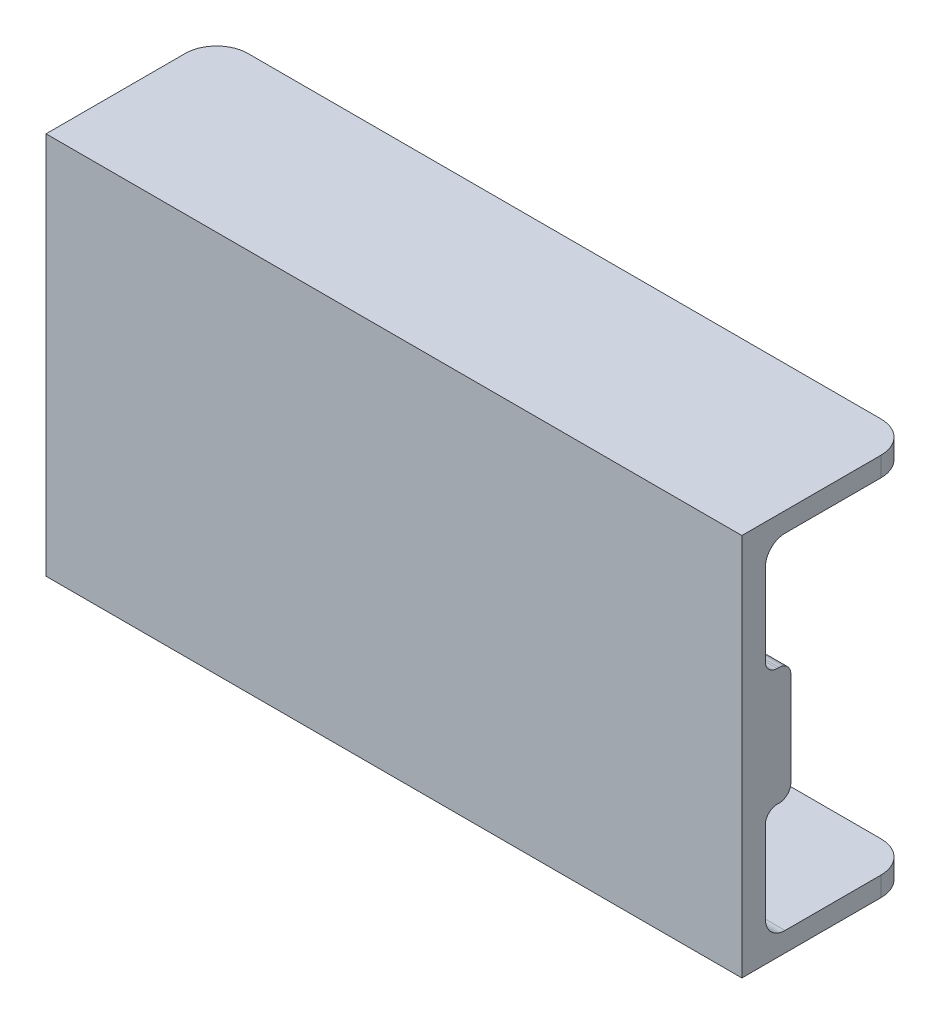
ISO-10303-21;
HEADER;
FILE_DESCRIPTION(('STEP AP214'),'2;1');
FILE_NAME('part.step','',(''),(''),'','','');
FILE_SCHEMA(('AUTOMOTIVE_DESIGN { 1 0 10303 214 1 1 1 1 }'));
ENDSEC;
DATA;
#1=APPLICATION_CONTEXT('core data for automotive mechanical design processes');
#2=APPLICATION_PROTOCOL_DEFINITION('international standard','automotive_design',2000,#1);
#3=PRODUCT_CONTEXT('',#1,'mechanical');
#4=PRODUCT('Part','Part','',(#3));
#5=PRODUCT_RELATED_PRODUCT_CATEGORY('part','',(#4));
#6=PRODUCT_DEFINITION_FORMATION('','',#4);
#7=PRODUCT_DEFINITION_CONTEXT('part definition',#1,'design');
#8=PRODUCT_DEFINITION('design','',#6,#7);
#9=PRODUCT_DEFINITION_SHAPE('','',#8);
#10=(LENGTH_UNIT() NAMED_UNIT(*) SI_UNIT(.MILLI.,.METRE.));
#11=(NAMED_UNIT(*) PLANE_ANGLE_UNIT() SI_UNIT($,.RADIAN.));
#12=(NAMED_UNIT(*) SI_UNIT($,.STERADIAN.) SOLID_ANGLE_UNIT());
#13=UNCERTAINTY_MEASURE_WITH_UNIT(LENGTH_MEASURE(1.E-05),#10,'distance_accuracy_value','');
#14=(GEOMETRIC_REPRESENTATION_CONTEXT(3) GLOBAL_UNCERTAINTY_ASSIGNED_CONTEXT((#13)) GLOBAL_UNIT_ASSIGNED_CONTEXT((#10,
#11,#12)) REPRESENTATION_CONTEXT('',''));
#15=CARTESIAN_POINT('',(0.,0.,0.));
#16=DIRECTION('',(0.,0.,1.));
#17=DIRECTION('',(1.,0.,0.));
#18=AXIS2_PLACEMENT_3D('',#15,#16,#17);
#19=CARTESIAN_POINT('',(0.,0.,0.));
#20=DIRECTION('',(0.,0.,-1.));
#21=DIRECTION('',(-1.,0.,0.));
#22=AXIS2_PLACEMENT_3D('',#19,#20,#21);
#23=PLANE('',#22);
#24=DIRECTION('',(0.,1.,0.));
#25=VECTOR('',#24,1.);
#26=CARTESIAN_POINT('',(17.75,-9.775,0.));
#27=LINE('',#26,#25);
#28=CARTESIAN_POINT('',(17.75,3.6,0.));
#29=VERTEX_POINT('',#28);
#30=CARTESIAN_POINT('',(17.75,7.775,0.));
#31=VERTEX_POINT('',#30);
#32=EDGE_CURVE('E426',#29,#31,#27,.T.);
#33=ORIENTED_EDGE('',*,*,#32,.F.);
#34=DIRECTION('',(1.,0.,0.));
#35=VECTOR('',#34,1.);
#36=CARTESIAN_POINT('',(0.,3.6,0.));
#37=LINE('',#36,#35);
#38=CARTESIAN_POINT('',(16.75,3.6,0.));
#39=VERTEX_POINT('',#38);
#40=EDGE_CURVE('E334',#29,#39,#37,.F.);
#41=ORIENTED_EDGE('',*,*,#40,.T.);
#42=DIRECTION('',(0.,1.,0.));
#43=VECTOR('',#42,1.);
#44=CARTESIAN_POINT('',(16.75,3.,0.));
#45=LINE('',#44,#43);
#46=CARTESIAN_POINT('',(16.75,-3.6,0.));
#47=VERTEX_POINT('',#46);
#48=EDGE_CURVE('E549',#47,#39,#45,.T.);
#49=ORIENTED_EDGE('',*,*,#48,.F.);
#50=DIRECTION('',(-1.,0.,0.));
#51=VECTOR('',#50,1.);
#52=CARTESIAN_POINT('',(0.,-3.6,0.));
#53=LINE('',#52,#51);
#54=CARTESIAN_POINT('',(17.75,-3.6,0.));
#55=VERTEX_POINT('',#54);
#56=EDGE_CURVE('E332',#47,#55,#53,.F.);
#57=ORIENTED_EDGE('',*,*,#56,.T.);
#58=CARTESIAN_POINT('',(17.75,-7.775,0.));
#59=VERTEX_POINT('',#58);
#60=EDGE_CURVE('E430',#59,#55,#27,.T.);
#61=ORIENTED_EDGE('',*,*,#60,.F.);
#62=DIRECTION('',(1.,0.,0.));
#63=VECTOR('',#62,1.);
#64=CARTESIAN_POINT('',(0.,-7.775,0.));
#65=LINE('',#64,#63);
#66=CARTESIAN_POINT('',(-17.75,-7.775,0.));
#67=VERTEX_POINT('',#66);
#68=EDGE_CURVE('E263',#59,#67,#65,.F.);
#69=ORIENTED_EDGE('',*,*,#68,.T.);
#70=DIRECTION('',(0.,-1.,0.));
#71=VECTOR('',#70,1.);
#72=CARTESIAN_POINT('',(-17.75,-9.775,0.));
#73=LINE('',#72,#71);
#74=CARTESIAN_POINT('',(-17.75,-3.6,0.));
#75=VERTEX_POINT('',#74);
#76=EDGE_CURVE('E433',#75,#67,#73,.T.);
#77=ORIENTED_EDGE('',*,*,#76,.F.);
#78=DIRECTION('',(-1.,0.,0.));
#79=VECTOR('',#78,1.);
#80=CARTESIAN_POINT('',(0.,-3.6,0.));
#81=LINE('',#80,#79);
#82=CARTESIAN_POINT('',(-16.75,-3.6,0.));
#83=VERTEX_POINT('',#82);
#84=EDGE_CURVE('E327',#75,#83,#81,.F.);
#85=ORIENTED_EDGE('',*,*,#84,.T.);
#86=DIRECTION('',(0.,-1.,0.));
#87=VECTOR('',#86,1.);
#88=CARTESIAN_POINT('',(-16.75,3.,0.));
#89=LINE('',#88,#87);
#90=CARTESIAN_POINT('',(-16.75,3.6,0.));
#91=VERTEX_POINT('',#90);
#92=EDGE_CURVE('E529',#91,#83,#89,.T.);
#93=ORIENTED_EDGE('',*,*,#92,.F.);
#94=DIRECTION('',(1.,0.,0.));
#95=VECTOR('',#94,1.);
#96=CARTESIAN_POINT('',(0.,3.6,0.));
#97=LINE('',#96,#95);
#98=CARTESIAN_POINT('',(-17.75,3.6,0.));
#99=VERTEX_POINT('',#98);
#100=EDGE_CURVE('E330',#91,#99,#97,.F.);
#101=ORIENTED_EDGE('',*,*,#100,.T.);
#102=CARTESIAN_POINT('',(-17.75,7.775,0.));
#103=VERTEX_POINT('',#102);
#104=EDGE_CURVE('E246',#103,#99,#73,.T.);
#105=ORIENTED_EDGE('',*,*,#104,.F.);
#106=DIRECTION('',(-1.,0.,0.));
#107=VECTOR('',#106,1.);
#108=CARTESIAN_POINT('',(0.,7.775,0.));
#109=LINE('',#108,#107);
#110=EDGE_CURVE('E255',#103,#31,#109,.F.);
#111=ORIENTED_EDGE('',*,*,#110,.T.);
#112=EDGE_LOOP('',(#33,#41,#49,#57,#61,#69,#77,#85,#93,#101,#105,#111));
#113=FACE_BOUND('',#112,.T.);
#114=ADVANCED_FACE('F33',(#113),#23,.T.);
#115=CARTESIAN_POINT('',(17.75,-9.775,1.2));
#116=DIRECTION('',(-1.,0.,0.));
#117=DIRECTION('',(0.,0.,1.));
#118=AXIS2_PLACEMENT_3D('',#115,#116,#117);
#119=PLANE('',#118);
#120=DIRECTION('',(0.,0.,-1.));
#121=VECTOR('',#120,1.);
#122=CARTESIAN_POINT('',(17.75,-9.775,1.2));
#123=LINE('',#122,#121);
#124=CARTESIAN_POINT('',(17.75,-9.775,1.2));
#125=VERTEX_POINT('',#124);
#126=CARTESIAN_POINT('',(17.75,-9.775,-5.9));
#127=VERTEX_POINT('',#126);
#128=EDGE_CURVE('E396',#125,#127,#123,.T.);
#129=ORIENTED_EDGE('',*,*,#128,.T.);
#130=DIRECTION('',(0.,-1.,0.));
#131=VECTOR('',#130,1.);
#132=CARTESIAN_POINT('',(17.75,-9.775,-5.9));
#133=LINE('',#132,#131);
#134=CARTESIAN_POINT('',(17.75,-8.775,-5.9));
#135=VERTEX_POINT('',#134);
#136=EDGE_CURVE('E366',#127,#135,#133,.F.);
#137=ORIENTED_EDGE('',*,*,#136,.T.);
#138=DIRECTION('',(0.,0.,1.));
#139=VECTOR('',#138,1.);
#140=CARTESIAN_POINT('',(17.75,-8.775,-7.5));
#141=LINE('',#140,#139);
#142=CARTESIAN_POINT('',(17.75,-8.775,-1.));
#143=VERTEX_POINT('',#142);
#144=EDGE_CURVE('E409',#135,#143,#141,.T.);
#145=ORIENTED_EDGE('',*,*,#144,.T.);
#146=CARTESIAN_POINT('',(17.75,-7.775,-1.));
#147=DIRECTION('',(-1.,0.,0.));
#148=DIRECTION('',(0.,0.,1.));
#149=AXIS2_PLACEMENT_3D('',#146,#147,#148);
#150=CIRCLE('',#149,1.);
#151=EDGE_CURVE('E269',#143,#59,#150,.T.);
#152=ORIENTED_EDGE('',*,*,#151,.T.);
#153=ORIENTED_EDGE('',*,*,#60,.T.);
#154=CARTESIAN_POINT('',(17.75,-3.6,-0.6));
#155=DIRECTION('',(-1.,0.,0.));
#156=DIRECTION('',(0.,0.,1.));
#157=AXIS2_PLACEMENT_3D('',#154,#155,#156);
#158=CIRCLE('',#157,0.6);
#159=CARTESIAN_POINT('',(17.75,-3.,-0.6));
#160=VERTEX_POINT('',#159);
#161=EDGE_CURVE('E344',#55,#160,#158,.T.);
#162=ORIENTED_EDGE('',*,*,#161,.T.);
#163=DIRECTION('',(0.,0.,1.));
#164=VECTOR('',#163,1.);
#165=CARTESIAN_POINT('',(17.75,-3.,-1.3));
#166=LINE('',#165,#164);
#167=CARTESIAN_POINT('',(17.75,-3.,-0.7));
#168=VERTEX_POINT('',#167);
#169=EDGE_CURVE('E539',#168,#160,#166,.T.);
#170=ORIENTED_EDGE('',*,*,#169,.F.);
#171=CARTESIAN_POINT('',(17.75,-2.4,-0.7));
#172=DIRECTION('',(-1.,0.,0.));
#173=DIRECTION('',(0.,0.,1.));
#174=AXIS2_PLACEMENT_3D('',#171,#172,#173);
#175=CIRCLE('',#174,0.6);
#176=CARTESIAN_POINT('',(17.75,-2.4,-1.3));
#177=VERTEX_POINT('',#176);
#178=EDGE_CURVE('E285',#168,#177,#175,.F.);
#179=ORIENTED_EDGE('',*,*,#178,.T.);
#180=DIRECTION('',(0.,-1.,0.));
#181=VECTOR('',#180,1.);
#182=CARTESIAN_POINT('',(17.75,3.,-1.3));
#183=LINE('',#182,#181);
#184=CARTESIAN_POINT('',(17.75,2.4,-1.3));
#185=VERTEX_POINT('',#184);
#186=EDGE_CURVE('E551',#185,#177,#183,.T.);
#187=ORIENTED_EDGE('',*,*,#186,.F.);
#188=CARTESIAN_POINT('',(17.75,2.4,-0.7));
#189=DIRECTION('',(-1.,0.,0.));
#190=DIRECTION('',(0.,0.,1.));
#191=AXIS2_PLACEMENT_3D('',#188,#189,#190);
#192=CIRCLE('',#191,0.6);
#193=CARTESIAN_POINT('',(17.75,3.,-0.7));
#194=VERTEX_POINT('',#193);
#195=EDGE_CURVE('E287',#185,#194,#192,.F.);
#196=ORIENTED_EDGE('',*,*,#195,.T.);
#197=DIRECTION('',(0.,0.,1.));
#198=VECTOR('',#197,1.);
#199=CARTESIAN_POINT('',(17.75,3.,-1.3));
#200=LINE('',#199,#198);
#201=CARTESIAN_POINT('',(17.75,3.,-0.6));
#202=VERTEX_POINT('',#201);
#203=EDGE_CURVE('E532',#194,#202,#200,.T.);
#204=ORIENTED_EDGE('',*,*,#203,.T.);
#205=CARTESIAN_POINT('',(17.75,3.6,-0.6));
#206=DIRECTION('',(-1.,0.,0.));
#207=DIRECTION('',(0.,0.,1.));
#208=AXIS2_PLACEMENT_3D('',#205,#206,#207);
#209=CIRCLE('',#208,0.6);
#210=EDGE_CURVE('E337',#202,#29,#209,.T.);
#211=ORIENTED_EDGE('',*,*,#210,.T.);
#212=ORIENTED_EDGE('',*,*,#32,.T.);
#213=CARTESIAN_POINT('',(17.75,7.775,-1.));
#214=DIRECTION('',(-1.,0.,0.));
#215=DIRECTION('',(0.,0.,1.));
#216=AXIS2_PLACEMENT_3D('',#213,#214,#215);
#217=CIRCLE('',#216,1.);
#218=CARTESIAN_POINT('',(17.75,8.775,-1.));
#219=VERTEX_POINT('',#218);
#220=EDGE_CURVE('E276',#31,#219,#217,.T.);
#221=ORIENTED_EDGE('',*,*,#220,.T.);
#222=DIRECTION('',(0.,0.,1.));
#223=VECTOR('',#222,1.);
#224=CARTESIAN_POINT('',(17.75,8.775,-7.5));
#225=LINE('',#224,#223);
#226=CARTESIAN_POINT('',(17.75,8.775,-5.9));
#227=VERTEX_POINT('',#226);
#228=EDGE_CURVE('E425',#227,#219,#225,.T.);
#229=ORIENTED_EDGE('',*,*,#228,.F.);
#230=DIRECTION('',(0.,-1.,0.));
#231=VECTOR('',#230,1.);
#232=CARTESIAN_POINT('',(17.75,9.775,-5.9));
#233=LINE('',#232,#231);
#234=CARTESIAN_POINT('',(17.75,9.775,-5.9));
#235=VERTEX_POINT('',#234);
#236=EDGE_CURVE('E251',#227,#235,#233,.F.);
#237=ORIENTED_EDGE('',*,*,#236,.T.);
#238=DIRECTION('',(0.,0.,-1.));
#239=VECTOR('',#238,1.);
#240=CARTESIAN_POINT('',(17.75,9.775,1.2));
#241=LINE('',#240,#239);
#242=CARTESIAN_POINT('',(17.75,9.775,1.2));
#243=VERTEX_POINT('',#242);
#244=EDGE_CURVE('E231',#243,#235,#241,.T.);
#245=ORIENTED_EDGE('',*,*,#244,.F.);
#246=DIRECTION('',(0.,1.,0.));
#247=VECTOR('',#246,1.);
#248=CARTESIAN_POINT('',(17.75,-9.775,1.2));
#249=LINE('',#248,#247);
#250=EDGE_CURVE('E237',#125,#243,#249,.T.);
#251=ORIENTED_EDGE('',*,*,#250,.F.);
#252=EDGE_LOOP('',(#129,#137,#145,#152,#153,#162,#170,#179,#187,#196,#204,#211,#212,#221,#229,
#237,#245,#251));
#253=FACE_BOUND('',#252,.T.);
#254=ADVANCED_FACE('F248',(#253),#119,.F.);
#255=CARTESIAN_POINT('',(-17.75,9.775,1.2));
#256=DIRECTION('',(0.,-1.,0.));
#257=DIRECTION('',(0.,0.,-1.));
#258=AXIS2_PLACEMENT_3D('',#255,#256,#257);
#259=PLANE('',#258);
#260=ORIENTED_EDGE('',*,*,#244,.T.);
#261=CARTESIAN_POINT('',(16.15,9.775,-5.9));
#262=DIRECTION('',(0.,-1.,0.));
#263=DIRECTION('',(0.,0.,-1.));
#264=AXIS2_PLACEMENT_3D('',#261,#262,#263);
#265=CIRCLE('',#264,1.6);
#266=CARTESIAN_POINT('',(16.15,9.775,-7.5));
#267=VERTEX_POINT('',#266);
#268=EDGE_CURVE('E383',#235,#267,#265,.F.);
#269=ORIENTED_EDGE('',*,*,#268,.T.);
#270=DIRECTION('',(1.,0.,0.));
#271=VECTOR('',#270,1.);
#272=CARTESIAN_POINT('',(17.75,9.775,-7.5));
#273=LINE('',#272,#271);
#274=CARTESIAN_POINT('',(-16.15,9.775,-7.5));
#275=VERTEX_POINT('',#274);
#276=EDGE_CURVE('E420',#275,#267,#273,.T.);
#277=ORIENTED_EDGE('',*,*,#276,.F.);
#278=CARTESIAN_POINT('',(-16.15,9.775,-5.9));
#279=DIRECTION('',(0.,-1.,0.));
#280=DIRECTION('',(0.,0.,-1.));
#281=AXIS2_PLACEMENT_3D('',#278,#279,#280);
#282=CIRCLE('',#281,1.6);
#283=CARTESIAN_POINT('',(-17.75,9.775,-5.9));
#284=VERTEX_POINT('',#283);
#285=EDGE_CURVE('E48',#275,#284,#282,.F.);
#286=ORIENTED_EDGE('',*,*,#285,.T.);
#287=DIRECTION('',(0.,0.,-1.));
#288=VECTOR('',#287,1.);
#289=CARTESIAN_POINT('',(-17.75,9.775,1.2));
#290=LINE('',#289,#288);
#291=CARTESIAN_POINT('',(-17.75,9.775,1.2));
#292=VERTEX_POINT('',#291);
#293=EDGE_CURVE('E233',#292,#284,#290,.T.);
#294=ORIENTED_EDGE('',*,*,#293,.F.);
#295=DIRECTION('',(-1.,0.,0.));
#296=VECTOR('',#295,1.);
#297=CARTESIAN_POINT('',(-17.75,9.775,1.2));
#298=LINE('',#297,#296);
#299=EDGE_CURVE('E227',#243,#292,#298,.T.);
#300=ORIENTED_EDGE('',*,*,#299,.F.);
#301=EDGE_LOOP('',(#260,#269,#277,#286,#294,#300));
#302=FACE_BOUND('',#301,.T.);
#303=ADVANCED_FACE('F229',(#302),#259,.F.);
#304=CARTESIAN_POINT('',(-17.75,-9.775,1.2));
#305=DIRECTION('',(1.,0.,0.));
#306=DIRECTION('',(0.,0.,-1.));
#307=AXIS2_PLACEMENT_3D('',#304,#305,#306);
#308=PLANE('',#307);
#309=ORIENTED_EDGE('',*,*,#293,.T.);
#310=DIRECTION('',(0.,1.,0.));
#311=VECTOR('',#310,1.);
#312=CARTESIAN_POINT('',(-17.75,8.775,-5.9));
#313=LINE('',#312,#311);
#314=CARTESIAN_POINT('',(-17.75,8.775,-5.9));
#315=VERTEX_POINT('',#314);
#316=EDGE_CURVE('E11',#284,#315,#313,.F.);
#317=ORIENTED_EDGE('',*,*,#316,.T.);
#318=DIRECTION('',(0.,0.,1.));
#319=VECTOR('',#318,1.);
#320=CARTESIAN_POINT('',(-17.75,8.775,-7.5));
#321=LINE('',#320,#319);
#322=CARTESIAN_POINT('',(-17.75,8.775,-1.));
#323=VERTEX_POINT('',#322);
#324=EDGE_CURVE('E423',#315,#323,#321,.T.);
#325=ORIENTED_EDGE('',*,*,#324,.T.);
#326=CARTESIAN_POINT('',(-17.75,7.775,-1.));
#327=DIRECTION('',(1.,0.,0.));
#328=DIRECTION('',(0.,0.,-1.));
#329=AXIS2_PLACEMENT_3D('',#326,#327,#328);
#330=CIRCLE('',#329,1.);
#331=EDGE_CURVE('E274',#323,#103,#330,.T.);
#332=ORIENTED_EDGE('',*,*,#331,.T.);
#333=ORIENTED_EDGE('',*,*,#104,.T.);
#334=CARTESIAN_POINT('',(-17.75,3.6,-0.6));
#335=DIRECTION('',(1.,0.,0.));
#336=DIRECTION('',(0.,0.,-1.));
#337=AXIS2_PLACEMENT_3D('',#334,#335,#336);
#338=CIRCLE('',#337,0.6);
#339=CARTESIAN_POINT('',(-17.75,3.,-0.6));
#340=VERTEX_POINT('',#339);
#341=EDGE_CURVE('E349',#99,#340,#338,.T.);
#342=ORIENTED_EDGE('',*,*,#341,.T.);
#343=DIRECTION('',(0.,0.,1.));
#344=VECTOR('',#343,1.);
#345=CARTESIAN_POINT('',(-17.75,3.,-1.3));
#346=LINE('',#345,#344);
#347=CARTESIAN_POINT('',(-17.75,3.,-0.7));
#348=VERTEX_POINT('',#347);
#349=EDGE_CURVE('E412',#348,#340,#346,.T.);
#350=ORIENTED_EDGE('',*,*,#349,.F.);
#351=CARTESIAN_POINT('',(-17.75,2.4,-0.7));
#352=DIRECTION('',(1.,0.,0.));
#353=DIRECTION('',(0.,0.,-1.));
#354=AXIS2_PLACEMENT_3D('',#351,#352,#353);
#355=CIRCLE('',#354,0.6);
#356=CARTESIAN_POINT('',(-17.75,2.4,-1.3));
#357=VERTEX_POINT('',#356);
#358=EDGE_CURVE('E320',#348,#357,#355,.F.);
#359=ORIENTED_EDGE('',*,*,#358,.T.);
#360=DIRECTION('',(0.,1.,0.));
#361=VECTOR('',#360,1.);
#362=CARTESIAN_POINT('',(-17.75,3.,-1.3));
#363=LINE('',#362,#361);
#364=CARTESIAN_POINT('',(-17.75,-2.4,-1.3));
#365=VERTEX_POINT('',#364);
#366=EDGE_CURVE('E531',#365,#357,#363,.T.);
#367=ORIENTED_EDGE('',*,*,#366,.F.);
#368=CARTESIAN_POINT('',(-17.75,-2.4,-0.7));
#369=DIRECTION('',(1.,0.,0.));
#370=DIRECTION('',(0.,0.,-1.));
#371=AXIS2_PLACEMENT_3D('',#368,#369,#370);
#372=CIRCLE('',#371,0.6);
#373=CARTESIAN_POINT('',(-17.75,-3.,-0.7));
#374=VERTEX_POINT('',#373);
#375=EDGE_CURVE('E318',#365,#374,#372,.F.);
#376=ORIENTED_EDGE('',*,*,#375,.T.);
#377=DIRECTION('',(0.,0.,1.));
#378=VECTOR('',#377,1.);
#379=CARTESIAN_POINT('',(-17.75,-3.,-1.3));
#380=LINE('',#379,#378);
#381=CARTESIAN_POINT('',(-17.75,-3.,-0.6));
#382=VERTEX_POINT('',#381);
#383=EDGE_CURVE('E525',#374,#382,#380,.T.);
#384=ORIENTED_EDGE('',*,*,#383,.T.);
#385=CARTESIAN_POINT('',(-17.75,-3.6,-0.6));
#386=DIRECTION('',(1.,0.,0.));
#387=DIRECTION('',(0.,0.,-1.));
#388=AXIS2_PLACEMENT_3D('',#385,#386,#387);
#389=CIRCLE('',#388,0.6);
#390=EDGE_CURVE('E351',#382,#75,#389,.T.);
#391=ORIENTED_EDGE('',*,*,#390,.T.);
#392=ORIENTED_EDGE('',*,*,#76,.T.);
#393=CARTESIAN_POINT('',(-17.75,-7.775,-1.));
#394=DIRECTION('',(1.,0.,0.));
#395=DIRECTION('',(0.,0.,-1.));
#396=AXIS2_PLACEMENT_3D('',#393,#394,#395);
#397=CIRCLE('',#396,1.);
#398=CARTESIAN_POINT('',(-17.75,-8.775,-1.));
#399=VERTEX_POINT('',#398);
#400=EDGE_CURVE('E271',#67,#399,#397,.T.);
#401=ORIENTED_EDGE('',*,*,#400,.T.);
#402=DIRECTION('',(0.,0.,1.));
#403=VECTOR('',#402,1.);
#404=CARTESIAN_POINT('',(-17.75,-8.775,-7.5));
#405=LINE('',#404,#403);
#406=CARTESIAN_POINT('',(-17.75,-8.775,-5.9));
#407=VERTEX_POINT('',#406);
#408=EDGE_CURVE('E389',#407,#399,#405,.T.);
#409=ORIENTED_EDGE('',*,*,#408,.F.);
#410=DIRECTION('',(0.,1.,0.));
#411=VECTOR('',#410,1.);
#412=CARTESIAN_POINT('',(-17.75,-9.775,-5.9));
#413=LINE('',#412,#411);
#414=CARTESIAN_POINT('',(-17.75,-9.775,-5.9));
#415=VERTEX_POINT('',#414);
#416=EDGE_CURVE('E41',#407,#415,#413,.F.);
#417=ORIENTED_EDGE('',*,*,#416,.T.);
#418=DIRECTION('',(0.,0.,-1.));
#419=VECTOR('',#418,1.);
#420=CARTESIAN_POINT('',(-17.75,-9.775,1.2));
#421=LINE('',#420,#419);
#422=CARTESIAN_POINT('',(-17.75,-9.775,1.2));
#423=VERTEX_POINT('',#422);
#424=EDGE_CURVE('E257',#423,#415,#421,.T.);
#425=ORIENTED_EDGE('',*,*,#424,.F.);
#426=DIRECTION('',(0.,-1.,0.));
#427=VECTOR('',#426,1.);
#428=CARTESIAN_POINT('',(-17.75,-9.775,1.2));
#429=LINE('',#428,#427);
#430=EDGE_CURVE('E236',#292,#423,#429,.T.);
#431=ORIENTED_EDGE('',*,*,#430,.F.);
#432=EDGE_LOOP('',(#309,#317,#325,#332,#333,#342,#350,#359,#367,#376,#384,#391,#392,#401,#409,
#417,#425,#431));
#433=FACE_BOUND('',#432,.T.);
#434=ADVANCED_FACE('F388',(#433),#308,.F.);
#435=CARTESIAN_POINT('',(-17.75,-9.775,1.2));
#436=DIRECTION('',(0.,1.,0.));
#437=DIRECTION('',(0.,0.,1.));
#438=AXIS2_PLACEMENT_3D('',#435,#436,#437);
#439=PLANE('',#438);
#440=DIRECTION('',(-1.,0.,0.));
#441=VECTOR('',#440,1.);
#442=CARTESIAN_POINT('',(17.75,-9.775,-7.5));
#443=LINE('',#442,#441);
#444=CARTESIAN_POINT('',(16.15,-9.775,-7.5));
#445=VERTEX_POINT('',#444);
#446=CARTESIAN_POINT('',(-16.15,-9.775,-7.5));
#447=VERTEX_POINT('',#446);
#448=EDGE_CURVE('E404',#445,#447,#443,.T.);
#449=ORIENTED_EDGE('',*,*,#448,.F.);
#450=CARTESIAN_POINT('',(16.15,-9.775,-5.9));
#451=DIRECTION('',(0.,1.,0.));
#452=DIRECTION('',(0.,0.,1.));
#453=AXIS2_PLACEMENT_3D('',#450,#451,#452);
#454=CIRCLE('',#453,1.6);
#455=EDGE_CURVE('E363',#445,#127,#454,.F.);
#456=ORIENTED_EDGE('',*,*,#455,.T.);
#457=ORIENTED_EDGE('',*,*,#128,.F.);
#458=DIRECTION('',(1.,0.,0.));
#459=VECTOR('',#458,1.);
#460=CARTESIAN_POINT('',(-17.75,-9.775,1.2));
#461=LINE('',#460,#459);
#462=EDGE_CURVE('E242',#423,#125,#461,.T.);
#463=ORIENTED_EDGE('',*,*,#462,.F.);
#464=ORIENTED_EDGE('',*,*,#424,.T.);
#465=CARTESIAN_POINT('',(-16.15,-9.775,-5.9));
#466=DIRECTION('',(0.,1.,0.));
#467=DIRECTION('',(0.,0.,1.));
#468=AXIS2_PLACEMENT_3D('',#465,#466,#467);
#469=CIRCLE('',#468,1.6);
#470=EDGE_CURVE('E361',#415,#447,#469,.F.);
#471=ORIENTED_EDGE('',*,*,#470,.T.);
#472=EDGE_LOOP('',(#449,#456,#457,#463,#464,#471));
#473=FACE_BOUND('',#472,.T.);
#474=ADVANCED_FACE('F394',(#473),#439,.F.);
#475=CARTESIAN_POINT('',(0.,0.,1.2));
#476=DIRECTION('',(0.,0.,-1.));
#477=DIRECTION('',(-1.,0.,0.));
#478=AXIS2_PLACEMENT_3D('',#475,#476,#477);
#479=PLANE('',#478);
#480=ORIENTED_EDGE('',*,*,#250,.T.);
#481=ORIENTED_EDGE('',*,*,#299,.T.);
#482=ORIENTED_EDGE('',*,*,#430,.T.);
#483=ORIENTED_EDGE('',*,*,#462,.T.);
#484=EDGE_LOOP('',(#480,#481,#482,#483));
#485=FACE_BOUND('',#484,.T.);
#486=ADVANCED_FACE('F240',(#485),#479,.F.);
#487=CARTESIAN_POINT('',(17.75,8.775,-7.5));
#488=DIRECTION('',(0.,1.,0.));
#489=DIRECTION('',(0.,0.,1.));
#490=AXIS2_PLACEMENT_3D('',#487,#488,#489);
#491=PLANE('',#490);
#492=DIRECTION('',(-1.,0.,0.));
#493=VECTOR('',#492,1.);
#494=CARTESIAN_POINT('',(17.75,8.775,-7.5));
#495=LINE('',#494,#493);
#496=CARTESIAN_POINT('',(16.15,8.775,-7.5));
#497=VERTEX_POINT('',#496);
#498=CARTESIAN_POINT('',(-16.15,8.775,-7.5));
#499=VERTEX_POINT('',#498);
#500=EDGE_CURVE('E417',#497,#499,#495,.T.);
#501=ORIENTED_EDGE('',*,*,#500,.F.);
#502=CARTESIAN_POINT('',(16.15,8.775,-5.9));
#503=DIRECTION('',(0.,1.,0.));
#504=DIRECTION('',(0.,0.,1.));
#505=AXIS2_PLACEMENT_3D('',#502,#503,#504);
#506=CIRCLE('',#505,1.6);
#507=EDGE_CURVE('E380',#497,#227,#506,.F.);
#508=ORIENTED_EDGE('',*,*,#507,.T.);
#509=ORIENTED_EDGE('',*,*,#228,.T.);
#510=DIRECTION('',(-1.,0.,0.));
#511=VECTOR('',#510,1.);
#512=CARTESIAN_POINT('',(17.75,8.775,-1.));
#513=LINE('',#512,#511);
#514=EDGE_CURVE('E266',#219,#323,#513,.T.);
#515=ORIENTED_EDGE('',*,*,#514,.T.);
#516=ORIENTED_EDGE('',*,*,#324,.F.);
#517=CARTESIAN_POINT('',(-16.15,8.775,-5.9));
#518=DIRECTION('',(0.,1.,0.));
#519=DIRECTION('',(0.,0.,1.));
#520=AXIS2_PLACEMENT_3D('',#517,#518,#519);
#521=CIRCLE('',#520,1.6);
#522=EDGE_CURVE('E378',#315,#499,#521,.F.);
#523=ORIENTED_EDGE('',*,*,#522,.T.);
#524=EDGE_LOOP('',(#501,#508,#509,#515,#516,#523));
#525=FACE_BOUND('',#524,.T.);
#526=ADVANCED_FACE('F586',(#525),#491,.F.);
#527=CARTESIAN_POINT('',(0.,0.,-7.5));
#528=DIRECTION('',(0.,0.,-1.));
#529=DIRECTION('',(-1.,0.,0.));
#530=AXIS2_PLACEMENT_3D('',#527,#528,#529);
#531=PLANE('',#530);
#532=ORIENTED_EDGE('',*,*,#276,.T.);
#533=DIRECTION('',(0.,-1.,0.));
#534=VECTOR('',#533,1.);
#535=CARTESIAN_POINT('',(16.15,8.775,-7.5));
#536=LINE('',#535,#534);
#537=EDGE_CURVE('E375',#267,#497,#536,.T.);
#538=ORIENTED_EDGE('',*,*,#537,.T.);
#539=ORIENTED_EDGE('',*,*,#500,.T.);
#540=DIRECTION('',(0.,1.,0.));
#541=VECTOR('',#540,1.);
#542=CARTESIAN_POINT('',(-16.15,9.775,-7.5));
#543=LINE('',#542,#541);
#544=EDGE_CURVE('E372',#499,#275,#543,.T.);
#545=ORIENTED_EDGE('',*,*,#544,.T.);
#546=EDGE_LOOP('',(#532,#538,#539,#545));
#547=FACE_BOUND('',#546,.T.);
#548=ADVANCED_FACE('F590',(#547),#531,.T.);
#549=CARTESIAN_POINT('',(17.75,-8.775,-7.5));
#550=DIRECTION('',(0.,-1.,0.));
#551=DIRECTION('',(0.,0.,-1.));
#552=AXIS2_PLACEMENT_3D('',#549,#550,#551);
#553=PLANE('',#552);
#554=ORIENTED_EDGE('',*,*,#144,.F.);
#555=CARTESIAN_POINT('',(16.15,-8.775,-5.9));
#556=DIRECTION('',(0.,-1.,0.));
#557=DIRECTION('',(0.,0.,-1.));
#558=AXIS2_PLACEMENT_3D('',#555,#556,#557);
#559=CIRCLE('',#558,1.6);
#560=CARTESIAN_POINT('',(16.15,-8.775,-7.5));
#561=VERTEX_POINT('',#560);
#562=EDGE_CURVE('E370',#135,#561,#559,.F.);
#563=ORIENTED_EDGE('',*,*,#562,.T.);
#564=DIRECTION('',(1.,0.,0.));
#565=VECTOR('',#564,1.);
#566=CARTESIAN_POINT('',(17.75,-8.775,-7.5));
#567=LINE('',#566,#565);
#568=CARTESIAN_POINT('',(-16.15,-8.775,-7.5));
#569=VERTEX_POINT('',#568);
#570=EDGE_CURVE('E402',#569,#561,#567,.T.);
#571=ORIENTED_EDGE('',*,*,#570,.F.);
#572=CARTESIAN_POINT('',(-16.15,-8.775,-5.9));
#573=DIRECTION('',(0.,-1.,0.));
#574=DIRECTION('',(0.,0.,-1.));
#575=AXIS2_PLACEMENT_3D('',#572,#573,#574);
#576=CIRCLE('',#575,1.6);
#577=EDGE_CURVE('E368',#569,#407,#576,.F.);
#578=ORIENTED_EDGE('',*,*,#577,.T.);
#579=ORIENTED_EDGE('',*,*,#408,.T.);
#580=DIRECTION('',(1.,0.,0.));
#581=VECTOR('',#580,1.);
#582=CARTESIAN_POINT('',(17.75,-8.775,-1.));
#583=LINE('',#582,#581);
#584=EDGE_CURVE('E252',#399,#143,#583,.T.);
#585=ORIENTED_EDGE('',*,*,#584,.T.);
#586=EDGE_LOOP('',(#554,#563,#571,#578,#579,#585));
#587=FACE_BOUND('',#586,.T.);
#588=ADVANCED_FACE('F407',(#587),#553,.F.);
#589=CARTESIAN_POINT('',(0.,0.,-7.5));
#590=DIRECTION('',(0.,0.,1.));
#591=DIRECTION('',(1.,0.,0.));
#592=AXIS2_PLACEMENT_3D('',#589,#590,#591);
#593=PLANE('',#592);
#594=ORIENTED_EDGE('',*,*,#570,.T.);
#595=DIRECTION('',(0.,-1.,0.));
#596=VECTOR('',#595,1.);
#597=CARTESIAN_POINT('',(16.15,0.,-7.5));
#598=LINE('',#597,#596);
#599=EDGE_CURVE('E358',#561,#445,#598,.T.);
#600=ORIENTED_EDGE('',*,*,#599,.T.);
#601=ORIENTED_EDGE('',*,*,#448,.T.);
#602=DIRECTION('',(0.,1.,0.));
#603=VECTOR('',#602,1.);
#604=CARTESIAN_POINT('',(-16.15,0.,-7.5));
#605=LINE('',#604,#603);
#606=EDGE_CURVE('E355',#447,#569,#605,.T.);
#607=ORIENTED_EDGE('',*,*,#606,.T.);
#608=EDGE_LOOP('',(#594,#600,#601,#607));
#609=FACE_BOUND('',#608,.T.);
#610=ADVANCED_FACE('F401',(#609),#593,.F.);
#611=CARTESIAN_POINT('',(17.75,-7.775,-1.));
#612=DIRECTION('',(1.,0.,0.));
#613=DIRECTION('',(0.,0.,-1.));
#614=AXIS2_PLACEMENT_3D('',#611,#612,#613);
#615=CYLINDRICAL_SURFACE('',#614,1.);
#616=ORIENTED_EDGE('',*,*,#400,.F.);
#617=ORIENTED_EDGE('',*,*,#68,.F.);
#618=ORIENTED_EDGE('',*,*,#151,.F.);
#619=ORIENTED_EDGE('',*,*,#584,.F.);
#620=EDGE_LOOP('',(#616,#617,#618,#619));
#621=FACE_BOUND('',#620,.T.);
#622=ADVANCED_FACE('F470',(#621),#615,.F.);
#623=CARTESIAN_POINT('',(17.75,7.775,-1.));
#624=DIRECTION('',(-1.,0.,0.));
#625=DIRECTION('',(0.,0.,1.));
#626=AXIS2_PLACEMENT_3D('',#623,#624,#625);
#627=CYLINDRICAL_SURFACE('',#626,1.);
#628=ORIENTED_EDGE('',*,*,#220,.F.);
#629=ORIENTED_EDGE('',*,*,#110,.F.);
#630=ORIENTED_EDGE('',*,*,#331,.F.);
#631=ORIENTED_EDGE('',*,*,#514,.F.);
#632=EDGE_LOOP('',(#628,#629,#630,#631));
#633=FACE_BOUND('',#632,.T.);
#634=ADVANCED_FACE('F473',(#633),#627,.F.);
#635=CARTESIAN_POINT('',(-17.75,3.,-1.3));
#636=DIRECTION('',(0.,-1.,0.));
#637=DIRECTION('',(0.,0.,-1.));
#638=AXIS2_PLACEMENT_3D('',#635,#636,#637);
#639=PLANE('',#638);
#640=DIRECTION('',(0.,0.,1.));
#641=VECTOR('',#640,1.);
#642=CARTESIAN_POINT('',(-16.75,3.,-1.3));
#643=LINE('',#642,#641);
#644=CARTESIAN_POINT('',(-16.75,3.,-0.7));
#645=VERTEX_POINT('',#644);
#646=CARTESIAN_POINT('',(-16.75,3.,-0.6));
#647=VERTEX_POINT('',#646);
#648=EDGE_CURVE('E519',#645,#647,#643,.T.);
#649=ORIENTED_EDGE('',*,*,#648,.F.);
#650=DIRECTION('',(1.,0.,0.));
#651=VECTOR('',#650,1.);
#652=CARTESIAN_POINT('',(-17.75,3.,-0.7));
#653=LINE('',#652,#651);
#654=EDGE_CURVE('E316',#645,#348,#653,.F.);
#655=ORIENTED_EDGE('',*,*,#654,.T.);
#656=ORIENTED_EDGE('',*,*,#349,.T.);
#657=DIRECTION('',(1.,0.,0.));
#658=VECTOR('',#657,1.);
#659=CARTESIAN_POINT('',(-17.75,3.,-0.6));
#660=LINE('',#659,#658);
#661=EDGE_CURVE('E313',#340,#647,#660,.T.);
#662=ORIENTED_EDGE('',*,*,#661,.T.);
#663=EDGE_LOOP('',(#649,#655,#656,#662));
#664=FACE_BOUND('',#663,.T.);
#665=ADVANCED_FACE('F477',(#664),#639,.F.);
#666=CARTESIAN_POINT('',(-16.75,3.,-1.3));
#667=DIRECTION('',(-1.,0.,0.));
#668=DIRECTION('',(0.,0.,1.));
#669=AXIS2_PLACEMENT_3D('',#666,#667,#668);
#670=PLANE('',#669);
#671=DIRECTION('',(0.,-1.,0.));
#672=VECTOR('',#671,1.);
#673=CARTESIAN_POINT('',(-16.75,3.,-1.3));
#674=LINE('',#673,#672);
#675=CARTESIAN_POINT('',(-16.75,2.4,-1.3));
#676=VERTEX_POINT('',#675);
#677=CARTESIAN_POINT('',(-16.75,-2.4,-1.3));
#678=VERTEX_POINT('',#677);
#679=EDGE_CURVE('E528',#676,#678,#674,.T.);
#680=ORIENTED_EDGE('',*,*,#679,.F.);
#681=CARTESIAN_POINT('',(-16.75,2.4,-0.7));
#682=DIRECTION('',(-1.,0.,0.));
#683=DIRECTION('',(0.,0.,1.));
#684=AXIS2_PLACEMENT_3D('',#681,#682,#683);
#685=CIRCLE('',#684,0.6);
#686=EDGE_CURVE('E311',#676,#645,#685,.F.);
#687=ORIENTED_EDGE('',*,*,#686,.T.);
#688=ORIENTED_EDGE('',*,*,#648,.T.);
#689=CARTESIAN_POINT('',(-16.75,3.6,-0.6));
#690=DIRECTION('',(-1.,0.,0.));
#691=DIRECTION('',(0.,0.,1.));
#692=AXIS2_PLACEMENT_3D('',#689,#690,#691);
#693=CIRCLE('',#692,0.6);
#694=EDGE_CURVE('E346',#647,#91,#693,.T.);
#695=ORIENTED_EDGE('',*,*,#694,.T.);
#696=ORIENTED_EDGE('',*,*,#92,.T.);
#697=CARTESIAN_POINT('',(-16.75,-3.6,-0.6));
#698=DIRECTION('',(-1.,0.,0.));
#699=DIRECTION('',(0.,0.,1.));
#700=AXIS2_PLACEMENT_3D('',#697,#698,#699);
#701=CIRCLE('',#700,0.6);
#702=CARTESIAN_POINT('',(-16.75,-3.,-0.6));
#703=VERTEX_POINT('',#702);
#704=EDGE_CURVE('E353',#83,#703,#701,.T.);
#705=ORIENTED_EDGE('',*,*,#704,.T.);
#706=DIRECTION('',(0.,0.,1.));
#707=VECTOR('',#706,1.);
#708=CARTESIAN_POINT('',(-16.75,-3.,-1.3));
#709=LINE('',#708,#707);
#710=CARTESIAN_POINT('',(-16.75,-3.,-0.7));
#711=VERTEX_POINT('',#710);
#712=EDGE_CURVE('E520',#711,#703,#709,.T.);
#713=ORIENTED_EDGE('',*,*,#712,.F.);
#714=CARTESIAN_POINT('',(-16.75,-2.4,-0.7));
#715=DIRECTION('',(-1.,0.,0.));
#716=DIRECTION('',(0.,0.,1.));
#717=AXIS2_PLACEMENT_3D('',#714,#715,#716);
#718=CIRCLE('',#717,0.6);
#719=EDGE_CURVE('E309',#711,#678,#718,.F.);
#720=ORIENTED_EDGE('',*,*,#719,.T.);
#721=EDGE_LOOP('',(#680,#687,#688,#695,#696,#705,#713,#720));
#722=FACE_BOUND('',#721,.T.);
#723=ADVANCED_FACE('F775',(#722),#670,.F.);
#724=CARTESIAN_POINT('',(-17.75,-3.,-1.3));
#725=DIRECTION('',(0.,1.,0.));
#726=DIRECTION('',(0.,0.,1.));
#727=AXIS2_PLACEMENT_3D('',#724,#725,#726);
#728=PLANE('',#727);
#729=ORIENTED_EDGE('',*,*,#383,.F.);
#730=DIRECTION('',(-1.,0.,0.));
#731=VECTOR('',#730,1.);
#732=CARTESIAN_POINT('',(-17.75,-3.,-0.7));
#733=LINE('',#732,#731);
#734=EDGE_CURVE('E325',#374,#711,#733,.F.);
#735=ORIENTED_EDGE('',*,*,#734,.T.);
#736=ORIENTED_EDGE('',*,*,#712,.T.);
#737=DIRECTION('',(-1.,0.,0.));
#738=VECTOR('',#737,1.);
#739=CARTESIAN_POINT('',(-17.75,-3.,-0.6));
#740=LINE('',#739,#738);
#741=EDGE_CURVE('E322',#703,#382,#740,.T.);
#742=ORIENTED_EDGE('',*,*,#741,.T.);
#743=EDGE_LOOP('',(#729,#735,#736,#742));
#744=FACE_BOUND('',#743,.T.);
#745=ADVANCED_FACE('F765',(#744),#728,.F.);
#746=CARTESIAN_POINT('',(0.,0.,-1.3));
#747=DIRECTION('',(0.,0.,1.));
#748=DIRECTION('',(1.,0.,0.));
#749=AXIS2_PLACEMENT_3D('',#746,#747,#748);
#750=PLANE('',#749);
#751=ORIENTED_EDGE('',*,*,#366,.T.);
#752=DIRECTION('',(1.,0.,0.));
#753=VECTOR('',#752,1.);
#754=CARTESIAN_POINT('',(0.,2.4,-1.3));
#755=LINE('',#754,#753);
#756=EDGE_CURVE('E306',#357,#676,#755,.T.);
#757=ORIENTED_EDGE('',*,*,#756,.T.);
#758=ORIENTED_EDGE('',*,*,#679,.T.);
#759=DIRECTION('',(-1.,0.,0.));
#760=VECTOR('',#759,1.);
#761=CARTESIAN_POINT('',(0.,-2.4,-1.3));
#762=LINE('',#761,#760);
#763=EDGE_CURVE('E303',#678,#365,#762,.T.);
#764=ORIENTED_EDGE('',*,*,#763,.T.);
#765=EDGE_LOOP('',(#751,#757,#758,#764));
#766=FACE_BOUND('',#765,.T.);
#767=ADVANCED_FACE('F756',(#766),#750,.F.);
#768=CARTESIAN_POINT('',(17.75,3.,-1.3));
#769=DIRECTION('',(0.,-1.,0.));
#770=DIRECTION('',(0.,0.,-1.));
#771=AXIS2_PLACEMENT_3D('',#768,#769,#770);
#772=PLANE('',#771);
#773=ORIENTED_EDGE('',*,*,#203,.F.);
#774=DIRECTION('',(1.,0.,0.));
#775=VECTOR('',#774,1.);
#776=CARTESIAN_POINT('',(17.75,3.,-0.7));
#777=LINE('',#776,#775);
#778=CARTESIAN_POINT('',(16.75,3.,-0.7));
#779=VERTEX_POINT('',#778);
#780=EDGE_CURVE('E292',#194,#779,#777,.F.);
#781=ORIENTED_EDGE('',*,*,#780,.T.);
#782=DIRECTION('',(0.,0.,1.));
#783=VECTOR('',#782,1.);
#784=CARTESIAN_POINT('',(16.75,3.,-1.3));
#785=LINE('',#784,#783);
#786=CARTESIAN_POINT('',(16.75,3.,-0.6));
#787=VERTEX_POINT('',#786);
#788=EDGE_CURVE('E545',#779,#787,#785,.T.);
#789=ORIENTED_EDGE('',*,*,#788,.T.);
#790=DIRECTION('',(1.,0.,0.));
#791=VECTOR('',#790,1.);
#792=CARTESIAN_POINT('',(17.75,3.,-0.6));
#793=LINE('',#792,#791);
#794=EDGE_CURVE('E289',#787,#202,#793,.T.);
#795=ORIENTED_EDGE('',*,*,#794,.T.);
#796=EDGE_LOOP('',(#773,#781,#789,#795));
#797=FACE_BOUND('',#796,.T.);
#798=ADVANCED_FACE('F577',(#797),#772,.F.);
#799=CARTESIAN_POINT('',(17.75,-3.,-1.3));
#800=DIRECTION('',(0.,1.,0.));
#801=DIRECTION('',(0.,0.,1.));
#802=AXIS2_PLACEMENT_3D('',#799,#800,#801);
#803=PLANE('',#802);
#804=DIRECTION('',(0.,0.,1.));
#805=VECTOR('',#804,1.);
#806=CARTESIAN_POINT('',(16.75,-3.,-1.3));
#807=LINE('',#806,#805);
#808=CARTESIAN_POINT('',(16.75,-3.,-0.7));
#809=VERTEX_POINT('',#808);
#810=CARTESIAN_POINT('',(16.75,-3.,-0.6));
#811=VERTEX_POINT('',#810);
#812=EDGE_CURVE('E542',#809,#811,#807,.T.);
#813=ORIENTED_EDGE('',*,*,#812,.F.);
#814=DIRECTION('',(-1.,0.,0.));
#815=VECTOR('',#814,1.);
#816=CARTESIAN_POINT('',(17.75,-3.,-0.7));
#817=LINE('',#816,#815);
#818=EDGE_CURVE('E301',#809,#168,#817,.F.);
#819=ORIENTED_EDGE('',*,*,#818,.T.);
#820=ORIENTED_EDGE('',*,*,#169,.T.);
#821=DIRECTION('',(-1.,0.,0.));
#822=VECTOR('',#821,1.);
#823=CARTESIAN_POINT('',(17.75,-3.,-0.6));
#824=LINE('',#823,#822);
#825=EDGE_CURVE('E298',#160,#811,#824,.T.);
#826=ORIENTED_EDGE('',*,*,#825,.T.);
#827=EDGE_LOOP('',(#813,#819,#820,#826));
#828=FACE_BOUND('',#827,.T.);
#829=ADVANCED_FACE('F567',(#828),#803,.F.);
#830=CARTESIAN_POINT('',(16.75,3.,-1.3));
#831=DIRECTION('',(1.,0.,0.));
#832=DIRECTION('',(0.,0.,-1.));
#833=AXIS2_PLACEMENT_3D('',#830,#831,#832);
#834=PLANE('',#833);
#835=ORIENTED_EDGE('',*,*,#788,.F.);
#836=CARTESIAN_POINT('',(16.75,2.4,-0.7));
#837=DIRECTION('',(1.,0.,0.));
#838=DIRECTION('',(0.,0.,-1.));
#839=AXIS2_PLACEMENT_3D('',#836,#837,#838);
#840=CIRCLE('',#839,0.6);
#841=CARTESIAN_POINT('',(16.75,2.4,-1.3));
#842=VERTEX_POINT('',#841);
#843=EDGE_CURVE('E296',#779,#842,#840,.F.);
#844=ORIENTED_EDGE('',*,*,#843,.T.);
#845=DIRECTION('',(0.,1.,0.));
#846=VECTOR('',#845,1.);
#847=CARTESIAN_POINT('',(16.75,3.,-1.3));
#848=LINE('',#847,#846);
#849=CARTESIAN_POINT('',(16.75,-2.4,-1.3));
#850=VERTEX_POINT('',#849);
#851=EDGE_CURVE('E548',#850,#842,#848,.T.);
#852=ORIENTED_EDGE('',*,*,#851,.F.);
#853=CARTESIAN_POINT('',(16.75,-2.4,-0.7));
#854=DIRECTION('',(1.,0.,0.));
#855=DIRECTION('',(0.,0.,-1.));
#856=AXIS2_PLACEMENT_3D('',#853,#854,#855);
#857=CIRCLE('',#856,0.6);
#858=EDGE_CURVE('E294',#850,#809,#857,.F.);
#859=ORIENTED_EDGE('',*,*,#858,.T.);
#860=ORIENTED_EDGE('',*,*,#812,.T.);
#861=CARTESIAN_POINT('',(16.75,-3.6,-0.6));
#862=DIRECTION('',(1.,0.,0.));
#863=DIRECTION('',(0.,0.,-1.));
#864=AXIS2_PLACEMENT_3D('',#861,#862,#863);
#865=CIRCLE('',#864,0.6);
#866=EDGE_CURVE('E341',#811,#47,#865,.T.);
#867=ORIENTED_EDGE('',*,*,#866,.T.);
#868=ORIENTED_EDGE('',*,*,#48,.T.);
#869=CARTESIAN_POINT('',(16.75,3.6,-0.6));
#870=DIRECTION('',(1.,0.,0.));
#871=DIRECTION('',(0.,0.,-1.));
#872=AXIS2_PLACEMENT_3D('',#869,#870,#871);
#873=CIRCLE('',#872,0.6);
#874=EDGE_CURVE('E339',#39,#787,#873,.T.);
#875=ORIENTED_EDGE('',*,*,#874,.T.);
#876=EDGE_LOOP('',(#835,#844,#852,#859,#860,#867,#868,#875));
#877=FACE_BOUND('',#876,.T.);
#878=ADVANCED_FACE('F565',(#877),#834,.F.);
#879=CARTESIAN_POINT('',(0.,0.,-1.3));
#880=DIRECTION('',(0.,0.,1.));
#881=DIRECTION('',(1.,0.,0.));
#882=AXIS2_PLACEMENT_3D('',#879,#880,#881);
#883=PLANE('',#882);
#884=ORIENTED_EDGE('',*,*,#851,.T.);
#885=DIRECTION('',(1.,0.,0.));
#886=VECTOR('',#885,1.);
#887=CARTESIAN_POINT('',(0.,2.4,-1.3));
#888=LINE('',#887,#886);
#889=EDGE_CURVE('E282',#842,#185,#888,.T.);
#890=ORIENTED_EDGE('',*,*,#889,.T.);
#891=ORIENTED_EDGE('',*,*,#186,.T.);
#892=DIRECTION('',(-1.,0.,0.));
#893=VECTOR('',#892,1.);
#894=CARTESIAN_POINT('',(0.,-2.4,-1.3));
#895=LINE('',#894,#893);
#896=EDGE_CURVE('E279',#177,#850,#895,.T.);
#897=ORIENTED_EDGE('',*,*,#896,.T.);
#898=EDGE_LOOP('',(#884,#890,#891,#897));
#899=FACE_BOUND('',#898,.T.);
#900=ADVANCED_FACE('F483',(#899),#883,.F.);
#901=CARTESIAN_POINT('',(0.,2.4,-0.7));
#902=DIRECTION('',(1.,0.,0.));
#903=DIRECTION('',(0.,0.,-1.));
#904=AXIS2_PLACEMENT_3D('',#901,#902,#903);
#905=CYLINDRICAL_SURFACE('',#904,0.6);
#906=ORIENTED_EDGE('',*,*,#843,.F.);
#907=ORIENTED_EDGE('',*,*,#780,.F.);
#908=ORIENTED_EDGE('',*,*,#195,.F.);
#909=ORIENTED_EDGE('',*,*,#889,.F.);
#910=EDGE_LOOP('',(#906,#907,#908,#909));
#911=FACE_BOUND('',#910,.T.);
#912=ADVANCED_FACE('F479',(#911),#905,.T.);
#913=CARTESIAN_POINT('',(0.,-2.4,-0.7));
#914=DIRECTION('',(-1.,0.,0.));
#915=DIRECTION('',(0.,0.,1.));
#916=AXIS2_PLACEMENT_3D('',#913,#914,#915);
#917=CYLINDRICAL_SURFACE('',#916,0.6);
#918=ORIENTED_EDGE('',*,*,#178,.F.);
#919=ORIENTED_EDGE('',*,*,#818,.F.);
#920=ORIENTED_EDGE('',*,*,#858,.F.);
#921=ORIENTED_EDGE('',*,*,#896,.F.);
#922=EDGE_LOOP('',(#918,#919,#920,#921));
#923=FACE_BOUND('',#922,.T.);
#924=ADVANCED_FACE('F482',(#923),#917,.T.);
#925=CARTESIAN_POINT('',(0.,2.4,-0.7));
#926=DIRECTION('',(1.,0.,0.));
#927=DIRECTION('',(0.,0.,-1.));
#928=AXIS2_PLACEMENT_3D('',#925,#926,#927);
#929=CYLINDRICAL_SURFACE('',#928,0.6);
#930=ORIENTED_EDGE('',*,*,#358,.F.);
#931=ORIENTED_EDGE('',*,*,#654,.F.);
#932=ORIENTED_EDGE('',*,*,#686,.F.);
#933=ORIENTED_EDGE('',*,*,#756,.F.);
#934=EDGE_LOOP('',(#930,#931,#932,#933));
#935=FACE_BOUND('',#934,.T.);
#936=ADVANCED_FACE('F487',(#935),#929,.T.);
#937=CARTESIAN_POINT('',(0.,-2.4,-0.7));
#938=DIRECTION('',(-1.,0.,0.));
#939=DIRECTION('',(0.,0.,1.));
#940=AXIS2_PLACEMENT_3D('',#937,#938,#939);
#941=CYLINDRICAL_SURFACE('',#940,0.6);
#942=ORIENTED_EDGE('',*,*,#719,.F.);
#943=ORIENTED_EDGE('',*,*,#734,.F.);
#944=ORIENTED_EDGE('',*,*,#375,.F.);
#945=ORIENTED_EDGE('',*,*,#763,.F.);
#946=EDGE_LOOP('',(#942,#943,#944,#945));
#947=FACE_BOUND('',#946,.T.);
#948=ADVANCED_FACE('F491',(#947),#941,.T.);
#949=CARTESIAN_POINT('',(17.75,3.6,-0.6));
#950=DIRECTION('',(1.,0.,0.));
#951=DIRECTION('',(0.,0.,-1.));
#952=AXIS2_PLACEMENT_3D('',#949,#950,#951);
#953=CYLINDRICAL_SURFACE('',#952,0.6);
#954=ORIENTED_EDGE('',*,*,#874,.F.);
#955=ORIENTED_EDGE('',*,*,#40,.F.);
#956=ORIENTED_EDGE('',*,*,#210,.F.);
#957=ORIENTED_EDGE('',*,*,#794,.F.);
#958=EDGE_LOOP('',(#954,#955,#956,#957));
#959=FACE_BOUND('',#958,.T.);
#960=ADVANCED_FACE('F495',(#959),#953,.F.);
#961=CARTESIAN_POINT('',(17.75,-3.6,-0.6));
#962=DIRECTION('',(-1.,0.,0.));
#963=DIRECTION('',(0.,0.,1.));
#964=AXIS2_PLACEMENT_3D('',#961,#962,#963);
#965=CYLINDRICAL_SURFACE('',#964,0.6);
#966=ORIENTED_EDGE('',*,*,#161,.F.);
#967=ORIENTED_EDGE('',*,*,#56,.F.);
#968=ORIENTED_EDGE('',*,*,#866,.F.);
#969=ORIENTED_EDGE('',*,*,#825,.F.);
#970=EDGE_LOOP('',(#966,#967,#968,#969));
#971=FACE_BOUND('',#970,.T.);
#972=ADVANCED_FACE('F499',(#971),#965,.F.);
#973=CARTESIAN_POINT('',(-17.75,3.6,-0.6));
#974=DIRECTION('',(1.,0.,0.));
#975=DIRECTION('',(0.,0.,-1.));
#976=AXIS2_PLACEMENT_3D('',#973,#974,#975);
#977=CYLINDRICAL_SURFACE('',#976,0.6);
#978=ORIENTED_EDGE('',*,*,#341,.F.);
#979=ORIENTED_EDGE('',*,*,#100,.F.);
#980=ORIENTED_EDGE('',*,*,#694,.F.);
#981=ORIENTED_EDGE('',*,*,#661,.F.);
#982=EDGE_LOOP('',(#978,#979,#980,#981));
#983=FACE_BOUND('',#982,.T.);
#984=ADVANCED_FACE('F450',(#983),#977,.F.);
#985=CARTESIAN_POINT('',(-17.75,-3.6,-0.6));
#986=DIRECTION('',(-1.,0.,0.));
#987=DIRECTION('',(0.,0.,1.));
#988=AXIS2_PLACEMENT_3D('',#985,#986,#987);
#989=CYLINDRICAL_SURFACE('',#988,0.6);
#990=ORIENTED_EDGE('',*,*,#704,.F.);
#991=ORIENTED_EDGE('',*,*,#84,.F.);
#992=ORIENTED_EDGE('',*,*,#390,.F.);
#993=ORIENTED_EDGE('',*,*,#741,.F.);
#994=EDGE_LOOP('',(#990,#991,#992,#993));
#995=FACE_BOUND('',#994,.T.);
#996=ADVANCED_FACE('F441',(#995),#989,.F.);
#997=CARTESIAN_POINT('',(16.15,0.,-5.9));
#998=DIRECTION('',(0.,-1.,0.));
#999=DIRECTION('',(0.,0.,-1.));
#1000=AXIS2_PLACEMENT_3D('',#997,#998,#999);
#1001=CYLINDRICAL_SURFACE('',#1000,1.6);
#1002=ORIENTED_EDGE('',*,*,#562,.F.);
#1003=ORIENTED_EDGE('',*,*,#136,.F.);
#1004=ORIENTED_EDGE('',*,*,#455,.F.);
#1005=ORIENTED_EDGE('',*,*,#599,.F.);
#1006=EDGE_LOOP('',(#1002,#1003,#1004,#1005));
#1007=FACE_BOUND('',#1006,.T.);
#1008=ADVANCED_FACE('F438',(#1007),#1001,.T.);
#1009=CARTESIAN_POINT('',(16.15,0.,-5.9));
#1010=DIRECTION('',(0.,1.,0.));
#1011=DIRECTION('',(0.,0.,1.));
#1012=AXIS2_PLACEMENT_3D('',#1009,#1010,#1011);
#1013=CYLINDRICAL_SURFACE('',#1012,1.6);
#1014=ORIENTED_EDGE('',*,*,#268,.F.);
#1015=ORIENTED_EDGE('',*,*,#236,.F.);
#1016=ORIENTED_EDGE('',*,*,#507,.F.);
#1017=ORIENTED_EDGE('',*,*,#537,.F.);
#1018=EDGE_LOOP('',(#1014,#1015,#1016,#1017));
#1019=FACE_BOUND('',#1018,.T.);
#1020=ADVANCED_FACE('F440',(#1019),#1013,.T.);
#1021=CARTESIAN_POINT('',(-16.15,0.,-5.9));
#1022=DIRECTION('',(0.,-1.,0.));
#1023=DIRECTION('',(0.,0.,-1.));
#1024=AXIS2_PLACEMENT_3D('',#1021,#1022,#1023);
#1025=CYLINDRICAL_SURFACE('',#1024,1.6);
#1026=ORIENTED_EDGE('',*,*,#522,.F.);
#1027=ORIENTED_EDGE('',*,*,#316,.F.);
#1028=ORIENTED_EDGE('',*,*,#285,.F.);
#1029=ORIENTED_EDGE('',*,*,#544,.F.);
#1030=EDGE_LOOP('',(#1026,#1027,#1028,#1029));
#1031=FACE_BOUND('',#1030,.T.);
#1032=ADVANCED_FACE('F447',(#1031),#1025,.T.);
#1033=CARTESIAN_POINT('',(-16.15,0.,-5.9));
#1034=DIRECTION('',(0.,1.,0.));
#1035=DIRECTION('',(0.,0.,1.));
#1036=AXIS2_PLACEMENT_3D('',#1033,#1034,#1035);
#1037=CYLINDRICAL_SURFACE('',#1036,1.6);
#1038=ORIENTED_EDGE('',*,*,#470,.F.);
#1039=ORIENTED_EDGE('',*,*,#416,.F.);
#1040=ORIENTED_EDGE('',*,*,#577,.F.);
#1041=ORIENTED_EDGE('',*,*,#606,.F.);
#1042=EDGE_LOOP('',(#1038,#1039,#1040,#1041));
#1043=FACE_BOUND('',#1042,.T.);
#1044=ADVANCED_FACE('F35',(#1043),#1037,.T.);
#1045=CLOSED_SHELL('',(#114,#254,#303,#434,#474,#486,#526,#548,#588,#610,#622,#634,#665,#723,
#745,#767,#798,#829,#878,#900,#912,#924,#936,#948,#960,#972,#984,#996,#1008,#1020,#1032,#1044));
#1046=MANIFOLD_SOLID_BREP('B2',#1045);
#1047=ADVANCED_BREP_SHAPE_REPRESENTATION('',(#18,#1046),#14);
#1048=SHAPE_DEFINITION_REPRESENTATION(#9,#1047);
ENDSEC;
END-ISO-10303-21;
